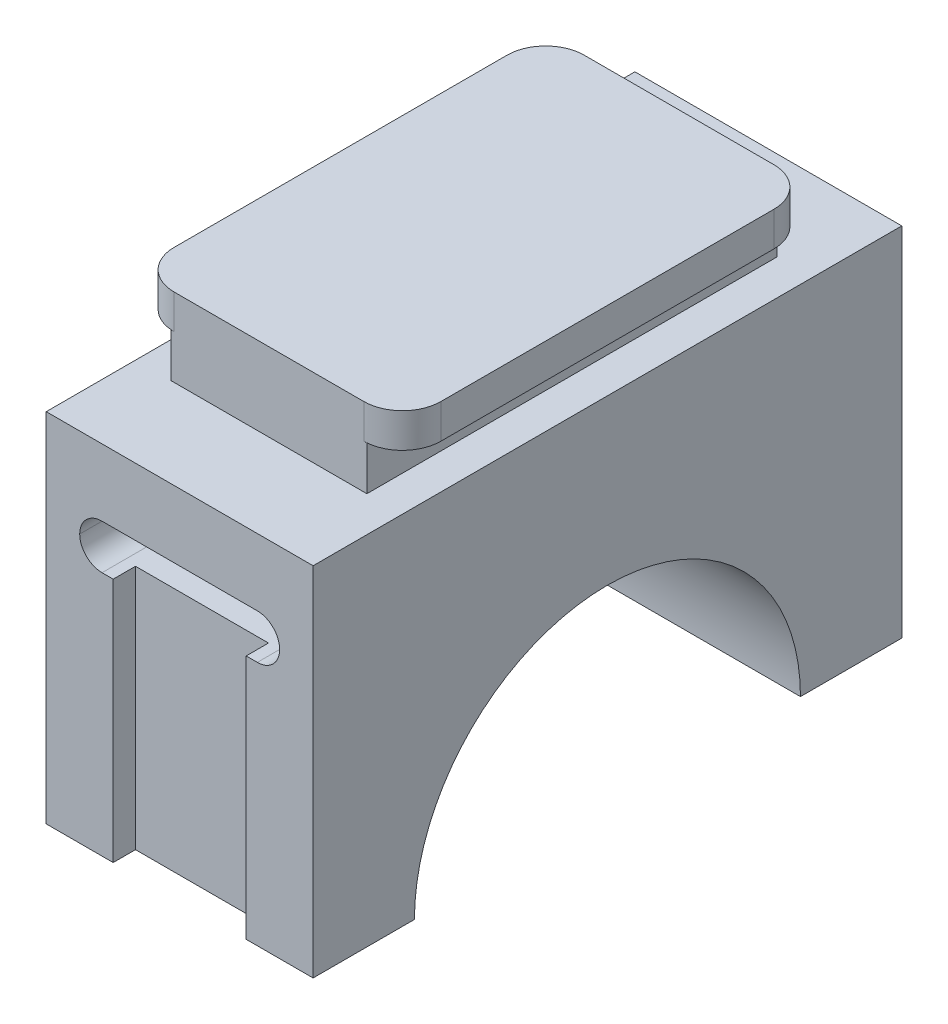
ISO-10303-21;
HEADER;
FILE_DESCRIPTION(('STEP AP214'),'2;1');
FILE_NAME('part.step','',(''),(''),'','','');
FILE_SCHEMA(('AUTOMOTIVE_DESIGN { 1 0 10303 214 1 1 1 1 }'));
ENDSEC;
DATA;
#1=APPLICATION_CONTEXT('core data for automotive mechanical design processes');
#2=APPLICATION_PROTOCOL_DEFINITION('international standard','automotive_design',2000,#1);
#3=PRODUCT_CONTEXT('',#1,'mechanical');
#4=PRODUCT('Part','Part','',(#3));
#5=PRODUCT_RELATED_PRODUCT_CATEGORY('part','',(#4));
#6=PRODUCT_DEFINITION_FORMATION('','',#4);
#7=PRODUCT_DEFINITION_CONTEXT('part definition',#1,'design');
#8=PRODUCT_DEFINITION('design','',#6,#7);
#9=PRODUCT_DEFINITION_SHAPE('','',#8);
#10=(LENGTH_UNIT() NAMED_UNIT(*) SI_UNIT(.MILLI.,.METRE.));
#11=(NAMED_UNIT(*) PLANE_ANGLE_UNIT() SI_UNIT($,.RADIAN.));
#12=(NAMED_UNIT(*) SI_UNIT($,.STERADIAN.) SOLID_ANGLE_UNIT());
#13=UNCERTAINTY_MEASURE_WITH_UNIT(LENGTH_MEASURE(1.E-05),#10,'distance_accuracy_value','');
#14=(GEOMETRIC_REPRESENTATION_CONTEXT(3) GLOBAL_UNCERTAINTY_ASSIGNED_CONTEXT((#13)) GLOBAL_UNIT_ASSIGNED_CONTEXT((#10,
#11,#12)) REPRESENTATION_CONTEXT('',''));
#15=CARTESIAN_POINT('',(0.,0.,0.));
#16=DIRECTION('',(0.,0.,1.));
#17=DIRECTION('',(1.,0.,0.));
#18=AXIS2_PLACEMENT_3D('',#15,#16,#17);
#19=CARTESIAN_POINT('',(0.,-22.8219,0.));
#20=DIRECTION('',(0.,-1.,0.));
#21=DIRECTION('',(0.,0.,-1.));
#22=AXIS2_PLACEMENT_3D('',#19,#20,#21);
#23=PLANE('',#22);
#24=DIRECTION('',(0.,0.,-1.));
#25=VECTOR('',#24,1.);
#26=CARTESIAN_POINT('',(11.3792,-22.8219,-3.81));
#27=LINE('',#26,#25);
#28=CARTESIAN_POINT('',(11.3792,-22.8219,-3.81));
#29=VERTEX_POINT('',#28);
#30=CARTESIAN_POINT('',(11.3792,-22.8219,-5.08));
#31=VERTEX_POINT('',#30);
#32=EDGE_CURVE('E298',#29,#31,#27,.T.);
#33=ORIENTED_EDGE('',*,*,#32,.T.);
#34=DIRECTION('',(1.,0.,0.));
#35=VECTOR('',#34,1.);
#36=CARTESIAN_POINT('',(15.1892,-22.8219,-5.08));
#37=LINE('',#36,#35);
#38=CARTESIAN_POINT('',(15.1892,-22.8219,-5.08));
#39=VERTEX_POINT('',#38);
#40=EDGE_CURVE('E341',#31,#39,#37,.T.);
#41=ORIENTED_EDGE('',*,*,#40,.T.);
#42=DIRECTION('',(0.,0.,1.));
#43=VECTOR('',#42,1.);
#44=CARTESIAN_POINT('',(15.1892,-22.8219,-5.08));
#45=LINE('',#44,#43);
#46=CARTESIAN_POINT('',(15.1892,-22.8219,0.685800000000004));
#47=VERTEX_POINT('',#46);
#48=EDGE_CURVE('E329',#39,#47,#45,.T.);
#49=ORIENTED_EDGE('',*,*,#48,.T.);
#50=DIRECTION('',(1.,0.,0.));
#51=VECTOR('',#50,1.);
#52=CARTESIAN_POINT('',(0.,-22.8219,0.685800000000004));
#53=LINE('',#52,#51);
#54=CARTESIAN_POINT('',(0.,-22.8219,0.685800000000004));
#55=VERTEX_POINT('',#54);
#56=EDGE_CURVE('E467',#55,#47,#53,.T.);
#57=ORIENTED_EDGE('',*,*,#56,.F.);
#58=DIRECTION('',(0.,0.,-1.));
#59=VECTOR('',#58,1.);
#60=CARTESIAN_POINT('',(0.,-22.8219,-5.08));
#61=LINE('',#60,#59);
#62=CARTESIAN_POINT('',(0.,-22.8219,-5.08));
#63=VERTEX_POINT('',#62);
#64=EDGE_CURVE('E337',#55,#63,#61,.T.);
#65=ORIENTED_EDGE('',*,*,#64,.T.);
#66=CARTESIAN_POINT('',(3.81,-22.8219,-5.08));
#67=VERTEX_POINT('',#66);
#68=EDGE_CURVE('E342',#63,#67,#37,.T.);
#69=ORIENTED_EDGE('',*,*,#68,.T.);
#70=DIRECTION('',(0.,0.,-1.));
#71=VECTOR('',#70,1.);
#72=CARTESIAN_POINT('',(3.81,-22.8219,-3.81));
#73=LINE('',#72,#71);
#74=CARTESIAN_POINT('',(3.81,-22.8219,-3.81));
#75=VERTEX_POINT('',#74);
#76=EDGE_CURVE('E307',#75,#67,#73,.T.);
#77=ORIENTED_EDGE('',*,*,#76,.F.);
#78=DIRECTION('',(-1.,0.,0.));
#79=VECTOR('',#78,1.);
#80=CARTESIAN_POINT('',(11.3792,-22.8219,-3.81));
#81=LINE('',#80,#79);
#82=EDGE_CURVE('E292',#29,#75,#81,.T.);
#83=ORIENTED_EDGE('',*,*,#82,.F.);
#84=EDGE_LOOP('',(#33,#41,#49,#57,#65,#69,#77,#83));
#85=FACE_BOUND('',#84,.T.);
#86=ADVANCED_FACE('F39',(#85),#23,.T.);
#87=CARTESIAN_POINT('',(2.1971,0.,21.1455));
#88=DIRECTION('',(0.,1.,0.));
#89=DIRECTION('',(0.,0.,1.));
#90=AXIS2_PLACEMENT_3D('',#87,#88,#89);
#91=PLANE('',#90);
#92=DIRECTION('',(0.,0.,1.));
#93=VECTOR('',#92,1.);
#94=CARTESIAN_POINT('',(13.1699,0.,0.));
#95=LINE('',#94,#93);
#96=CARTESIAN_POINT('',(13.1699,0.,0.00720603681365504));
#97=VERTEX_POINT('',#96);
#98=CARTESIAN_POINT('',(13.1699,0.,23.3353939631863));
#99=VERTEX_POINT('',#98);
#100=EDGE_CURVE('E384',#97,#99,#95,.T.);
#101=ORIENTED_EDGE('',*,*,#100,.F.);
#102=CARTESIAN_POINT('',(12.9921,0.,2.1971));
#103=DIRECTION('',(0.,1.,0.));
#104=DIRECTION('',(0.,0.,-1.));
#105=AXIS2_PLACEMENT_3D('',#102,#103,#104);
#106=CIRCLE('',#105,2.1971);
#107=CARTESIAN_POINT('',(15.1892,0.,2.19710000000002));
#108=VERTEX_POINT('',#107);
#109=EDGE_CURVE('E437',#108,#97,#106,.T.);
#110=ORIENTED_EDGE('',*,*,#109,.F.);
#111=DIRECTION('',(0.,0.,-1.));
#112=VECTOR('',#111,1.);
#113=CARTESIAN_POINT('',(15.1892,0.,2.19710000000001));
#114=LINE('',#113,#112);
#115=CARTESIAN_POINT('',(15.1892,0.,21.1455));
#116=VERTEX_POINT('',#115);
#117=EDGE_CURVE('E434',#116,#108,#114,.T.);
#118=ORIENTED_EDGE('',*,*,#117,.F.);
#119=CARTESIAN_POINT('',(12.9921,0.,21.1455));
#120=DIRECTION('',(0.,1.,0.));
#121=DIRECTION('',(0.,0.,1.));
#122=AXIS2_PLACEMENT_3D('',#119,#120,#121);
#123=CIRCLE('',#122,2.1971);
#124=EDGE_CURVE('E430',#99,#116,#123,.T.);
#125=ORIENTED_EDGE('',*,*,#124,.F.);
#126=EDGE_LOOP('',(#101,#110,#118,#125));
#127=FACE_BOUND('',#126,.T.);
#128=ADVANCED_FACE('F572',(#127),#91,.F.);
#129=DIRECTION('',(0.,0.,-1.));
#130=VECTOR('',#129,1.);
#131=CARTESIAN_POINT('',(2.0193,0.,0.));
#132=LINE('',#131,#130);
#133=CARTESIAN_POINT('',(2.0193,0.,23.3353939631863));
#134=VERTEX_POINT('',#133);
#135=CARTESIAN_POINT('',(2.0193,0.,0.00720603681365417));
#136=VERTEX_POINT('',#135);
#137=EDGE_CURVE('E393',#134,#136,#132,.T.);
#138=ORIENTED_EDGE('',*,*,#137,.F.);
#139=CARTESIAN_POINT('',(2.1971,0.,21.1455));
#140=DIRECTION('',(0.,1.,0.));
#141=DIRECTION('',(0.,0.,1.));
#142=AXIS2_PLACEMENT_3D('',#139,#140,#141);
#143=CIRCLE('',#142,2.1971);
#144=CARTESIAN_POINT('',(0.,0.,21.1455));
#145=VERTEX_POINT('',#144);
#146=EDGE_CURVE('E427',#145,#134,#143,.T.);
#147=ORIENTED_EDGE('',*,*,#146,.F.);
#148=DIRECTION('',(0.,0.,1.));
#149=VECTOR('',#148,1.);
#150=CARTESIAN_POINT('',(0.,0.,2.19710000000002));
#151=LINE('',#150,#149);
#152=CARTESIAN_POINT('',(0.,0.,2.19710000000002));
#153=VERTEX_POINT('',#152);
#154=EDGE_CURVE('E412',#153,#145,#151,.T.);
#155=ORIENTED_EDGE('',*,*,#154,.F.);
#156=CARTESIAN_POINT('',(2.1971,0.,2.1971));
#157=DIRECTION('',(0.,1.,0.));
#158=DIRECTION('',(0.,0.,1.));
#159=AXIS2_PLACEMENT_3D('',#156,#157,#158);
#160=CIRCLE('',#159,2.1971);
#161=EDGE_CURVE('E440',#136,#153,#160,.T.);
#162=ORIENTED_EDGE('',*,*,#161,.F.);
#163=EDGE_LOOP('',(#138,#147,#155,#162));
#164=FACE_BOUND('',#163,.T.);
#165=ADVANCED_FACE('F577',(#164),#91,.F.);
#166=CARTESIAN_POINT('',(2.1971,1.9558,21.1455));
#167=DIRECTION('',(0.,-1.,0.));
#168=DIRECTION('',(0.,0.,-1.));
#169=AXIS2_PLACEMENT_3D('',#166,#167,#168);
#170=CYLINDRICAL_SURFACE('',#169,2.1971);
#171=ORIENTED_EDGE('',*,*,#146,.T.);
#172=CARTESIAN_POINT('',(2.19710000000002,0.,23.3426));
#173=VERTEX_POINT('',#172);
#174=EDGE_CURVE('E407',#134,#173,#143,.T.);
#175=ORIENTED_EDGE('',*,*,#174,.T.);
#176=DIRECTION('',(0.,-1.,0.));
#177=VECTOR('',#176,1.);
#178=CARTESIAN_POINT('',(2.19710000000002,1.9558,23.3426));
#179=LINE('',#178,#177);
#180=CARTESIAN_POINT('',(2.19710000000002,1.9558,23.3426));
#181=VERTEX_POINT('',#180);
#182=EDGE_CURVE('E462',#181,#173,#179,.T.);
#183=ORIENTED_EDGE('',*,*,#182,.F.);
#184=CARTESIAN_POINT('',(2.1971,1.9558,21.1455));
#185=DIRECTION('',(0.,1.,0.));
#186=DIRECTION('',(0.,0.,1.));
#187=AXIS2_PLACEMENT_3D('',#184,#185,#186);
#188=CIRCLE('',#187,2.1971);
#189=CARTESIAN_POINT('',(0.,1.9558,21.1455));
#190=VERTEX_POINT('',#189);
#191=EDGE_CURVE('E408',#190,#181,#188,.T.);
#192=ORIENTED_EDGE('',*,*,#191,.F.);
#193=DIRECTION('',(0.,-1.,0.));
#194=VECTOR('',#193,1.);
#195=CARTESIAN_POINT('',(0.,1.9558,21.1455));
#196=LINE('',#195,#194);
#197=EDGE_CURVE('E426',#190,#145,#196,.T.);
#198=ORIENTED_EDGE('',*,*,#197,.T.);
#199=EDGE_LOOP('',(#171,#175,#183,#192,#198));
#200=FACE_BOUND('',#199,.T.);
#201=ADVANCED_FACE('F624',(#200),#170,.T.);
#202=CARTESIAN_POINT('',(2.19710000000002,1.9558,23.3426));
#203=DIRECTION('',(0.,0.,-1.));
#204=DIRECTION('',(-1.,0.,0.));
#205=AXIS2_PLACEMENT_3D('',#202,#203,#204);
#206=PLANE('',#205);
#207=ORIENTED_EDGE('',*,*,#182,.T.);
#208=DIRECTION('',(-1.,0.,0.));
#209=VECTOR('',#208,1.);
#210=CARTESIAN_POINT('',(13.1699,0.,23.3426));
#211=LINE('',#210,#209);
#212=CARTESIAN_POINT('',(2.0193,0.,23.3426));
#213=VERTEX_POINT('',#212);
#214=EDGE_CURVE('E383',#173,#213,#211,.T.);
#215=ORIENTED_EDGE('',*,*,#214,.T.);
#216=DIRECTION('',(0.,1.,0.));
#217=VECTOR('',#216,1.);
#218=CARTESIAN_POINT('',(2.0193,-2.5019,23.3426));
#219=LINE('',#218,#217);
#220=CARTESIAN_POINT('',(2.0193,-2.5019,23.3426));
#221=VERTEX_POINT('',#220);
#222=EDGE_CURVE('E401',#221,#213,#219,.T.);
#223=ORIENTED_EDGE('',*,*,#222,.F.);
#224=DIRECTION('',(-1.,0.,0.));
#225=VECTOR('',#224,1.);
#226=CARTESIAN_POINT('',(13.1699,-2.5019,23.3426));
#227=LINE('',#226,#225);
#228=CARTESIAN_POINT('',(13.1699,-2.5019,23.3426));
#229=VERTEX_POINT('',#228);
#230=EDGE_CURVE('E369',#229,#221,#227,.T.);
#231=ORIENTED_EDGE('',*,*,#230,.F.);
#232=DIRECTION('',(0.,1.,0.));
#233=VECTOR('',#232,1.);
#234=CARTESIAN_POINT('',(13.1699,-2.5019,23.3426));
#235=LINE('',#234,#233);
#236=CARTESIAN_POINT('',(13.1699,0.,23.3426));
#237=VERTEX_POINT('',#236);
#238=EDGE_CURVE('E404',#229,#237,#235,.T.);
#239=ORIENTED_EDGE('',*,*,#238,.T.);
#240=CARTESIAN_POINT('',(12.9921,0.,23.3426));
#241=VERTEX_POINT('',#240);
#242=EDGE_CURVE('E385',#237,#241,#211,.T.);
#243=ORIENTED_EDGE('',*,*,#242,.T.);
#244=DIRECTION('',(0.,-1.,0.));
#245=VECTOR('',#244,1.);
#246=CARTESIAN_POINT('',(12.9921,1.9558,23.3426));
#247=LINE('',#246,#245);
#248=CARTESIAN_POINT('',(12.9921,1.9558,23.3426));
#249=VERTEX_POINT('',#248);
#250=EDGE_CURVE('E460',#249,#241,#247,.T.);
#251=ORIENTED_EDGE('',*,*,#250,.F.);
#252=DIRECTION('',(1.,0.,0.));
#253=VECTOR('',#252,1.);
#254=CARTESIAN_POINT('',(2.19710000000002,1.9558,23.3426));
#255=LINE('',#254,#253);
#256=EDGE_CURVE('E411',#181,#249,#255,.T.);
#257=ORIENTED_EDGE('',*,*,#256,.F.);
#258=EDGE_LOOP('',(#207,#215,#223,#231,#239,#243,#251,#257));
#259=FACE_BOUND('',#258,.T.);
#260=ADVANCED_FACE('F627',(#259),#206,.F.);
#261=CARTESIAN_POINT('',(12.9921,1.9558,21.1455));
#262=DIRECTION('',(0.,-1.,0.));
#263=DIRECTION('',(0.,0.,-1.));
#264=AXIS2_PLACEMENT_3D('',#261,#262,#263);
#265=CYLINDRICAL_SURFACE('',#264,2.1971);
#266=EDGE_CURVE('E431',#241,#99,#123,.T.);
#267=ORIENTED_EDGE('',*,*,#266,.T.);
#268=ORIENTED_EDGE('',*,*,#124,.T.);
#269=DIRECTION('',(0.,-1.,0.));
#270=VECTOR('',#269,1.);
#271=CARTESIAN_POINT('',(15.1892,1.9558,21.1455));
#272=LINE('',#271,#270);
#273=CARTESIAN_POINT('',(15.1892,1.9558,21.1455));
#274=VERTEX_POINT('',#273);
#275=EDGE_CURVE('E457',#274,#116,#272,.T.);
#276=ORIENTED_EDGE('',*,*,#275,.F.);
#277=CARTESIAN_POINT('',(12.9921,1.9558,21.1455));
#278=DIRECTION('',(0.,1.,0.));
#279=DIRECTION('',(0.,0.,1.));
#280=AXIS2_PLACEMENT_3D('',#277,#278,#279);
#281=CIRCLE('',#280,2.1971);
#282=EDGE_CURVE('E414',#249,#274,#281,.T.);
#283=ORIENTED_EDGE('',*,*,#282,.F.);
#284=ORIENTED_EDGE('',*,*,#250,.T.);
#285=EDGE_LOOP('',(#267,#268,#276,#283,#284));
#286=FACE_BOUND('',#285,.T.);
#287=ADVANCED_FACE('F631',(#286),#265,.T.);
#288=CARTESIAN_POINT('',(15.1892,1.9558,2.19710000000001));
#289=DIRECTION('',(-1.,0.,0.));
#290=DIRECTION('',(0.,0.,1.));
#291=AXIS2_PLACEMENT_3D('',#288,#289,#290);
#292=PLANE('',#291);
#293=ORIENTED_EDGE('',*,*,#117,.T.);
#294=DIRECTION('',(0.,-1.,0.));
#295=VECTOR('',#294,1.);
#296=CARTESIAN_POINT('',(15.1892,1.9558,2.19710000000002));
#297=LINE('',#296,#295);
#298=CARTESIAN_POINT('',(15.1892,1.9558,2.19710000000002));
#299=VERTEX_POINT('',#298);
#300=EDGE_CURVE('E454',#299,#108,#297,.T.);
#301=ORIENTED_EDGE('',*,*,#300,.F.);
#302=DIRECTION('',(0.,0.,-1.));
#303=VECTOR('',#302,1.);
#304=CARTESIAN_POINT('',(15.1892,1.9558,2.19710000000001));
#305=LINE('',#304,#303);
#306=EDGE_CURVE('E416',#274,#299,#305,.T.);
#307=ORIENTED_EDGE('',*,*,#306,.F.);
#308=ORIENTED_EDGE('',*,*,#275,.T.);
#309=EDGE_LOOP('',(#293,#301,#307,#308));
#310=FACE_BOUND('',#309,.T.);
#311=ADVANCED_FACE('F635',(#310),#292,.F.);
#312=CARTESIAN_POINT('',(12.9921,1.9558,2.1971));
#313=DIRECTION('',(0.,-1.,0.));
#314=DIRECTION('',(0.,0.,-1.));
#315=AXIS2_PLACEMENT_3D('',#312,#313,#314);
#316=CYLINDRICAL_SURFACE('',#315,2.1971);
#317=ORIENTED_EDGE('',*,*,#109,.T.);
#318=CARTESIAN_POINT('',(12.9921,0.,0.));
#319=VERTEX_POINT('',#318);
#320=EDGE_CURVE('E436',#97,#319,#106,.T.);
#321=ORIENTED_EDGE('',*,*,#320,.T.);
#322=DIRECTION('',(0.,-1.,0.));
#323=VECTOR('',#322,1.);
#324=CARTESIAN_POINT('',(12.9921,1.9558,0.));
#325=LINE('',#324,#323);
#326=CARTESIAN_POINT('',(12.9921,1.9558,0.));
#327=VERTEX_POINT('',#326);
#328=EDGE_CURVE('E451',#327,#319,#325,.T.);
#329=ORIENTED_EDGE('',*,*,#328,.F.);
#330=CARTESIAN_POINT('',(12.9921,1.9558,2.1971));
#331=DIRECTION('',(0.,1.,0.));
#332=DIRECTION('',(0.,0.,-1.));
#333=AXIS2_PLACEMENT_3D('',#330,#331,#332);
#334=CIRCLE('',#333,2.1971);
#335=EDGE_CURVE('E418',#299,#327,#334,.T.);
#336=ORIENTED_EDGE('',*,*,#335,.F.);
#337=ORIENTED_EDGE('',*,*,#300,.T.);
#338=EDGE_LOOP('',(#317,#321,#329,#336,#337));
#339=FACE_BOUND('',#338,.T.);
#340=ADVANCED_FACE('F639',(#339),#316,.T.);
#341=CARTESIAN_POINT('',(2.19710000000002,1.9558,0.));
#342=DIRECTION('',(0.,0.,1.));
#343=DIRECTION('',(1.,0.,0.));
#344=AXIS2_PLACEMENT_3D('',#341,#342,#343);
#345=PLANE('',#344);
#346=ORIENTED_EDGE('',*,*,#328,.T.);
#347=DIRECTION('',(1.,0.,0.));
#348=VECTOR('',#347,1.);
#349=CARTESIAN_POINT('',(13.1699,0.,0.));
#350=LINE('',#349,#348);
#351=CARTESIAN_POINT('',(13.1699,0.,0.));
#352=VERTEX_POINT('',#351);
#353=EDGE_CURVE('E392',#319,#352,#350,.T.);
#354=ORIENTED_EDGE('',*,*,#353,.T.);
#355=DIRECTION('',(0.,1.,0.));
#356=VECTOR('',#355,1.);
#357=CARTESIAN_POINT('',(13.1699,-2.5019,0.));
#358=LINE('',#357,#356);
#359=CARTESIAN_POINT('',(13.1699,-2.5019,0.));
#360=VERTEX_POINT('',#359);
#361=EDGE_CURVE('E379',#360,#352,#358,.T.);
#362=ORIENTED_EDGE('',*,*,#361,.F.);
#363=DIRECTION('',(1.,0.,0.));
#364=VECTOR('',#363,1.);
#365=CARTESIAN_POINT('',(13.1699,-2.5019,0.));
#366=LINE('',#365,#364);
#367=CARTESIAN_POINT('',(2.0193,-2.5019,0.));
#368=VERTEX_POINT('',#367);
#369=EDGE_CURVE('E376',#368,#360,#366,.T.);
#370=ORIENTED_EDGE('',*,*,#369,.F.);
#371=DIRECTION('',(0.,1.,0.));
#372=VECTOR('',#371,1.);
#373=CARTESIAN_POINT('',(2.0193,-2.5019,0.));
#374=LINE('',#373,#372);
#375=CARTESIAN_POINT('',(2.0193,0.,0.));
#376=VERTEX_POINT('',#375);
#377=EDGE_CURVE('E398',#368,#376,#374,.T.);
#378=ORIENTED_EDGE('',*,*,#377,.T.);
#379=CARTESIAN_POINT('',(2.19710000000002,0.,0.));
#380=VERTEX_POINT('',#379);
#381=EDGE_CURVE('E370',#376,#380,#350,.T.);
#382=ORIENTED_EDGE('',*,*,#381,.T.);
#383=DIRECTION('',(0.,-1.,0.));
#384=VECTOR('',#383,1.);
#385=CARTESIAN_POINT('',(2.19710000000002,1.9558,0.));
#386=LINE('',#385,#384);
#387=CARTESIAN_POINT('',(2.19710000000002,1.9558,0.));
#388=VERTEX_POINT('',#387);
#389=EDGE_CURVE('E449',#388,#380,#386,.T.);
#390=ORIENTED_EDGE('',*,*,#389,.F.);
#391=DIRECTION('',(-1.,0.,0.));
#392=VECTOR('',#391,1.);
#393=CARTESIAN_POINT('',(2.19710000000002,1.9558,0.));
#394=LINE('',#393,#392);
#395=EDGE_CURVE('E420',#327,#388,#394,.T.);
#396=ORIENTED_EDGE('',*,*,#395,.F.);
#397=EDGE_LOOP('',(#346,#354,#362,#370,#378,#382,#390,#396));
#398=FACE_BOUND('',#397,.T.);
#399=ADVANCED_FACE('F643',(#398),#345,.F.);
#400=CARTESIAN_POINT('',(2.1971,1.9558,2.1971));
#401=DIRECTION('',(0.,-1.,0.));
#402=DIRECTION('',(0.,0.,-1.));
#403=AXIS2_PLACEMENT_3D('',#400,#401,#402);
#404=CYLINDRICAL_SURFACE('',#403,2.1971);
#405=EDGE_CURVE('E441',#380,#136,#160,.T.);
#406=ORIENTED_EDGE('',*,*,#405,.T.);
#407=ORIENTED_EDGE('',*,*,#161,.T.);
#408=DIRECTION('',(0.,-1.,0.));
#409=VECTOR('',#408,1.);
#410=CARTESIAN_POINT('',(0.,1.9558,2.19710000000002));
#411=LINE('',#410,#409);
#412=CARTESIAN_POINT('',(0.,1.9558,2.19710000000002));
#413=VERTEX_POINT('',#412);
#414=EDGE_CURVE('E446',#413,#153,#411,.T.);
#415=ORIENTED_EDGE('',*,*,#414,.F.);
#416=CARTESIAN_POINT('',(2.1971,1.9558,2.1971));
#417=DIRECTION('',(0.,1.,0.));
#418=DIRECTION('',(0.,0.,1.));
#419=AXIS2_PLACEMENT_3D('',#416,#417,#418);
#420=CIRCLE('',#419,2.1971);
#421=EDGE_CURVE('E422',#388,#413,#420,.T.);
#422=ORIENTED_EDGE('',*,*,#421,.F.);
#423=ORIENTED_EDGE('',*,*,#389,.T.);
#424=EDGE_LOOP('',(#406,#407,#415,#422,#423));
#425=FACE_BOUND('',#424,.T.);
#426=ADVANCED_FACE('F647',(#425),#404,.T.);
#427=CARTESIAN_POINT('',(0.,1.9558,2.19710000000002));
#428=DIRECTION('',(1.,0.,0.));
#429=DIRECTION('',(0.,0.,-1.));
#430=AXIS2_PLACEMENT_3D('',#427,#428,#429);
#431=PLANE('',#430);
#432=ORIENTED_EDGE('',*,*,#154,.T.);
#433=ORIENTED_EDGE('',*,*,#197,.F.);
#434=DIRECTION('',(0.,0.,1.));
#435=VECTOR('',#434,1.);
#436=CARTESIAN_POINT('',(0.,1.9558,2.19710000000002));
#437=LINE('',#436,#435);
#438=EDGE_CURVE('E424',#413,#190,#437,.T.);
#439=ORIENTED_EDGE('',*,*,#438,.F.);
#440=ORIENTED_EDGE('',*,*,#414,.T.);
#441=EDGE_LOOP('',(#432,#433,#439,#440));
#442=FACE_BOUND('',#441,.T.);
#443=ADVANCED_FACE('F651',(#442),#431,.F.);
#444=CARTESIAN_POINT('',(2.1971,1.9558,21.1455));
#445=DIRECTION('',(0.,1.,0.));
#446=DIRECTION('',(0.,0.,1.));
#447=AXIS2_PLACEMENT_3D('',#444,#445,#446);
#448=PLANE('',#447);
#449=ORIENTED_EDGE('',*,*,#191,.T.);
#450=ORIENTED_EDGE('',*,*,#256,.T.);
#451=ORIENTED_EDGE('',*,*,#282,.T.);
#452=ORIENTED_EDGE('',*,*,#306,.T.);
#453=ORIENTED_EDGE('',*,*,#335,.T.);
#454=ORIENTED_EDGE('',*,*,#395,.T.);
#455=ORIENTED_EDGE('',*,*,#421,.T.);
#456=ORIENTED_EDGE('',*,*,#438,.T.);
#457=EDGE_LOOP('',(#449,#450,#451,#452,#453,#454,#455,#456));
#458=FACE_BOUND('',#457,.T.);
#459=ADVANCED_FACE('F654',(#458),#448,.T.);
#460=CARTESIAN_POINT('',(0.,0.,0.));
#461=DIRECTION('',(0.,-1.,0.));
#462=DIRECTION('',(0.,0.,-1.));
#463=AXIS2_PLACEMENT_3D('',#460,#461,#462);
#464=PLANE('',#463);
#465=ORIENTED_EDGE('',*,*,#174,.F.);
#466=EDGE_CURVE('E389',#213,#134,#132,.T.);
#467=ORIENTED_EDGE('',*,*,#466,.F.);
#468=ORIENTED_EDGE('',*,*,#214,.F.);
#469=EDGE_LOOP('',(#465,#467,#468));
#470=FACE_BOUND('',#469,.T.);
#471=ADVANCED_FACE('F659',(#470),#464,.F.);
#472=ORIENTED_EDGE('',*,*,#405,.F.);
#473=ORIENTED_EDGE('',*,*,#381,.F.);
#474=EDGE_CURVE('E388',#136,#376,#132,.T.);
#475=ORIENTED_EDGE('',*,*,#474,.F.);
#476=EDGE_LOOP('',(#472,#473,#475));
#477=FACE_BOUND('',#476,.T.);
#478=ADVANCED_FACE('F813',(#477),#464,.F.);
#479=ORIENTED_EDGE('',*,*,#320,.F.);
#480=EDGE_CURVE('E380',#352,#97,#95,.T.);
#481=ORIENTED_EDGE('',*,*,#480,.F.);
#482=ORIENTED_EDGE('',*,*,#353,.F.);
#483=EDGE_LOOP('',(#479,#481,#482));
#484=FACE_BOUND('',#483,.T.);
#485=ADVANCED_FACE('F665',(#484),#464,.F.);
#486=CARTESIAN_POINT('',(13.1699,-2.5019,0.));
#487=DIRECTION('',(-1.,0.,0.));
#488=DIRECTION('',(0.,0.,1.));
#489=AXIS2_PLACEMENT_3D('',#486,#487,#488);
#490=PLANE('',#489);
#491=ORIENTED_EDGE('',*,*,#480,.T.);
#492=ORIENTED_EDGE('',*,*,#100,.T.);
#493=EDGE_CURVE('E365',#99,#237,#95,.T.);
#494=ORIENTED_EDGE('',*,*,#493,.T.);
#495=ORIENTED_EDGE('',*,*,#238,.F.);
#496=DIRECTION('',(0.,0.,1.));
#497=VECTOR('',#496,1.);
#498=CARTESIAN_POINT('',(13.1699,-2.5019,0.));
#499=LINE('',#498,#497);
#500=EDGE_CURVE('E366',#360,#229,#499,.T.);
#501=ORIENTED_EDGE('',*,*,#500,.F.);
#502=ORIENTED_EDGE('',*,*,#361,.T.);
#503=EDGE_LOOP('',(#491,#492,#494,#495,#501,#502));
#504=FACE_BOUND('',#503,.T.);
#505=ADVANCED_FACE('F661',(#504),#490,.F.);
#506=CARTESIAN_POINT('',(2.0193,-2.5019,0.));
#507=DIRECTION('',(1.,0.,0.));
#508=DIRECTION('',(0.,0.,-1.));
#509=AXIS2_PLACEMENT_3D('',#506,#507,#508);
#510=PLANE('',#509);
#511=ORIENTED_EDGE('',*,*,#466,.T.);
#512=ORIENTED_EDGE('',*,*,#137,.T.);
#513=ORIENTED_EDGE('',*,*,#474,.T.);
#514=ORIENTED_EDGE('',*,*,#377,.F.);
#515=DIRECTION('',(0.,0.,-1.));
#516=VECTOR('',#515,1.);
#517=CARTESIAN_POINT('',(2.0193,-2.5019,0.));
#518=LINE('',#517,#516);
#519=EDGE_CURVE('E373',#221,#368,#518,.T.);
#520=ORIENTED_EDGE('',*,*,#519,.F.);
#521=ORIENTED_EDGE('',*,*,#222,.T.);
#522=EDGE_LOOP('',(#511,#512,#513,#514,#520,#521));
#523=FACE_BOUND('',#522,.T.);
#524=ADVANCED_FACE('F664',(#523),#510,.F.);
#525=ORIENTED_EDGE('',*,*,#266,.F.);
#526=ORIENTED_EDGE('',*,*,#242,.F.);
#527=ORIENTED_EDGE('',*,*,#493,.F.);
#528=EDGE_LOOP('',(#525,#526,#527));
#529=FACE_BOUND('',#528,.T.);
#530=ADVANCED_FACE('F669',(#529),#464,.F.);
#531=CARTESIAN_POINT('',(0.,-2.5019,0.));
#532=DIRECTION('',(0.,-1.,0.));
#533=DIRECTION('',(0.,0.,-1.));
#534=AXIS2_PLACEMENT_3D('',#531,#532,#533);
#535=PLANE('',#534);
#536=DIRECTION('',(0.,0.,1.));
#537=VECTOR('',#536,1.);
#538=CARTESIAN_POINT('',(15.1892,-2.5019,-5.08));
#539=LINE('',#538,#537);
#540=CARTESIAN_POINT('',(15.1892,-2.5019,-5.08));
#541=VERTEX_POINT('',#540);
#542=CARTESIAN_POINT('',(15.1892,-2.5019,28.4226));
#543=VERTEX_POINT('',#542);
#544=EDGE_CURVE('E327',#541,#543,#539,.T.);
#545=ORIENTED_EDGE('',*,*,#544,.F.);
#546=DIRECTION('',(1.,0.,0.));
#547=VECTOR('',#546,1.);
#548=CARTESIAN_POINT('',(15.1892,-2.5019,-5.08));
#549=LINE('',#548,#547);
#550=CARTESIAN_POINT('',(0.,-2.5019,-5.08));
#551=VERTEX_POINT('',#550);
#552=EDGE_CURVE('E352',#551,#541,#549,.T.);
#553=ORIENTED_EDGE('',*,*,#552,.F.);
#554=DIRECTION('',(0.,0.,-1.));
#555=VECTOR('',#554,1.);
#556=CARTESIAN_POINT('',(0.,-2.5019,-5.08));
#557=LINE('',#556,#555);
#558=CARTESIAN_POINT('',(0.,-2.5019,28.4226));
#559=VERTEX_POINT('',#558);
#560=EDGE_CURVE('E350',#559,#551,#557,.T.);
#561=ORIENTED_EDGE('',*,*,#560,.F.);
#562=DIRECTION('',(-1.,0.,0.));
#563=VECTOR('',#562,1.);
#564=CARTESIAN_POINT('',(15.1892,-2.5019,28.4226));
#565=LINE('',#564,#563);
#566=EDGE_CURVE('E348',#543,#559,#565,.T.);
#567=ORIENTED_EDGE('',*,*,#566,.F.);
#568=EDGE_LOOP('',(#545,#553,#561,#567));
#569=FACE_BOUND('',#568,.T.);
#570=ORIENTED_EDGE('',*,*,#369,.T.);
#571=ORIENTED_EDGE('',*,*,#500,.T.);
#572=ORIENTED_EDGE('',*,*,#230,.T.);
#573=ORIENTED_EDGE('',*,*,#519,.T.);
#574=EDGE_LOOP('',(#570,#571,#572,#573));
#575=FACE_BOUND('',#574,.T.);
#576=ADVANCED_FACE('F531',(#569,#575),#535,.F.);
#577=CARTESIAN_POINT('',(15.1892,-22.8219,-5.08));
#578=DIRECTION('',(-1.,0.,0.));
#579=DIRECTION('',(0.,0.,1.));
#580=AXIS2_PLACEMENT_3D('',#577,#578,#579);
#581=PLANE('',#580);
#582=CARTESIAN_POINT('',(15.1892,-22.8219,22.6568));
#583=VERTEX_POINT('',#582);
#584=CARTESIAN_POINT('',(15.1892,-22.8219,28.4226));
#585=VERTEX_POINT('',#584);
#586=EDGE_CURVE('E333',#583,#585,#45,.T.);
#587=ORIENTED_EDGE('',*,*,#586,.F.);
#588=CARTESIAN_POINT('',(15.1892,-22.8219,11.6713));
#589=DIRECTION('',(1.,0.,0.));
#590=DIRECTION('',(0.,0.,-1.));
#591=AXIS2_PLACEMENT_3D('',#588,#589,#590);
#592=CIRCLE('',#591,10.9855);
#593=EDGE_CURVE('E318',#47,#583,#592,.T.);
#594=ORIENTED_EDGE('',*,*,#593,.F.);
#595=ORIENTED_EDGE('',*,*,#48,.F.);
#596=DIRECTION('',(0.,1.,0.));
#597=VECTOR('',#596,1.);
#598=CARTESIAN_POINT('',(15.1892,-22.8219,-5.08));
#599=LINE('',#598,#597);
#600=EDGE_CURVE('E345',#39,#541,#599,.T.);
#601=ORIENTED_EDGE('',*,*,#600,.T.);
#602=ORIENTED_EDGE('',*,*,#544,.T.);
#603=DIRECTION('',(0.,1.,0.));
#604=VECTOR('',#603,1.);
#605=CARTESIAN_POINT('',(15.1892,-22.8219,28.4226));
#606=LINE('',#605,#604);
#607=EDGE_CURVE('E362',#585,#543,#606,.T.);
#608=ORIENTED_EDGE('',*,*,#607,.F.);
#609=EDGE_LOOP('',(#587,#594,#595,#601,#602,#608));
#610=FACE_BOUND('',#609,.T.);
#611=ADVANCED_FACE('F536',(#610),#581,.F.);
#612=CARTESIAN_POINT('',(15.1892,-22.8219,28.4226));
#613=DIRECTION('',(0.,0.,-1.));
#614=DIRECTION('',(-1.,0.,0.));
#615=AXIS2_PLACEMENT_3D('',#612,#613,#614);
#616=PLANE('',#615);
#617=DIRECTION('',(1.,0.,0.));
#618=VECTOR('',#617,1.);
#619=CARTESIAN_POINT('',(1.905,-8.8519,28.4226));
#620=LINE('',#619,#618);
#621=CARTESIAN_POINT('',(11.3792,-8.8519,28.4226));
#622=VERTEX_POINT('',#621);
#623=CARTESIAN_POINT('',(12.0142,-8.8519,28.4226));
#624=VERTEX_POINT('',#623);
#625=EDGE_CURVE('E321',#622,#624,#620,.T.);
#626=ORIENTED_EDGE('',*,*,#625,.F.);
#627=DIRECTION('',(0.,1.,0.));
#628=VECTOR('',#627,1.);
#629=CARTESIAN_POINT('',(11.3792,-22.8219,28.4226));
#630=LINE('',#629,#628);
#631=CARTESIAN_POINT('',(11.3792,-22.8219,28.4226));
#632=VERTEX_POINT('',#631);
#633=EDGE_CURVE('E593',#632,#622,#630,.T.);
#634=ORIENTED_EDGE('',*,*,#633,.F.);
#635=DIRECTION('',(-1.,0.,0.));
#636=VECTOR('',#635,1.);
#637=CARTESIAN_POINT('',(15.1892,-22.8219,28.4226));
#638=LINE('',#637,#636);
#639=EDGE_CURVE('E334',#585,#632,#638,.T.);
#640=ORIENTED_EDGE('',*,*,#639,.F.);
#641=ORIENTED_EDGE('',*,*,#607,.T.);
#642=ORIENTED_EDGE('',*,*,#566,.T.);
#643=DIRECTION('',(0.,1.,0.));
#644=VECTOR('',#643,1.);
#645=CARTESIAN_POINT('',(0.,-22.8219,28.4226));
#646=LINE('',#645,#644);
#647=CARTESIAN_POINT('',(0.,-22.8219,28.4226));
#648=VERTEX_POINT('',#647);
#649=EDGE_CURVE('E359',#648,#559,#646,.T.);
#650=ORIENTED_EDGE('',*,*,#649,.F.);
#651=CARTESIAN_POINT('',(3.81,-22.8219,28.4226));
#652=VERTEX_POINT('',#651);
#653=EDGE_CURVE('E332',#652,#648,#638,.T.);
#654=ORIENTED_EDGE('',*,*,#653,.F.);
#655=DIRECTION('',(0.,-1.,0.));
#656=VECTOR('',#655,1.);
#657=CARTESIAN_POINT('',(3.81,-22.8219,28.4226));
#658=LINE('',#657,#656);
#659=CARTESIAN_POINT('',(3.81,-8.8519,28.4226));
#660=VERTEX_POINT('',#659);
#661=EDGE_CURVE('E591',#660,#652,#658,.T.);
#662=ORIENTED_EDGE('',*,*,#661,.F.);
#663=CARTESIAN_POINT('',(3.175,-8.8519,28.4226));
#664=VERTEX_POINT('',#663);
#665=EDGE_CURVE('E281',#664,#660,#620,.T.);
#666=ORIENTED_EDGE('',*,*,#665,.F.);
#667=CARTESIAN_POINT('',(3.175,-7.5819,28.4226));
#668=DIRECTION('',(0.,0.,-1.));
#669=DIRECTION('',(-1.,0.,0.));
#670=AXIS2_PLACEMENT_3D('',#667,#668,#669);
#671=CIRCLE('',#670,1.27);
#672=CARTESIAN_POINT('',(1.905,-7.5819,28.4226));
#673=VERTEX_POINT('',#672);
#674=EDGE_CURVE('E48',#664,#673,#671,.T.);
#675=ORIENTED_EDGE('',*,*,#674,.T.);
#676=CARTESIAN_POINT('',(3.175,-7.5819,28.4226));
#677=DIRECTION('',(0.,0.,-1.));
#678=DIRECTION('',(-1.,0.,0.));
#679=AXIS2_PLACEMENT_3D('',#676,#677,#678);
#680=CIRCLE('',#679,1.27);
#681=CARTESIAN_POINT('',(3.175,-6.3119,28.4226));
#682=VERTEX_POINT('',#681);
#683=EDGE_CURVE('E488',#673,#682,#680,.T.);
#684=ORIENTED_EDGE('',*,*,#683,.T.);
#685=DIRECTION('',(-1.,0.,0.));
#686=VECTOR('',#685,1.);
#687=CARTESIAN_POINT('',(1.905,-6.3119,28.4226));
#688=LINE('',#687,#686);
#689=CARTESIAN_POINT('',(12.0142,-6.3119,28.4226));
#690=VERTEX_POINT('',#689);
#691=EDGE_CURVE('E320',#690,#682,#688,.T.);
#692=ORIENTED_EDGE('',*,*,#691,.F.);
#693=CARTESIAN_POINT('',(12.0142,-7.5819,28.4226));
#694=DIRECTION('',(0.,0.,-1.));
#695=DIRECTION('',(-1.,0.,0.));
#696=AXIS2_PLACEMENT_3D('',#693,#694,#695);
#697=CIRCLE('',#696,1.27);
#698=CARTESIAN_POINT('',(13.2842,-7.5819,28.4226));
#699=VERTEX_POINT('',#698);
#700=EDGE_CURVE('E484',#690,#699,#697,.T.);
#701=ORIENTED_EDGE('',*,*,#700,.T.);
#702=CARTESIAN_POINT('',(12.0142,-7.5819,28.4226));
#703=DIRECTION('',(0.,0.,-1.));
#704=DIRECTION('',(-1.,0.,0.));
#705=AXIS2_PLACEMENT_3D('',#702,#703,#704);
#706=CIRCLE('',#705,1.27);
#707=EDGE_CURVE('E479',#699,#624,#706,.T.);
#708=ORIENTED_EDGE('',*,*,#707,.T.);
#709=EDGE_LOOP('',(#626,#634,#640,#641,#642,#650,#654,#662,#666,#675,#684,#692,#701,#708));
#710=FACE_BOUND('',#709,.T.);
#711=ADVANCED_FACE('F549',(#710),#616,.F.);
#712=CARTESIAN_POINT('',(0.,-22.8219,-5.08));
#713=DIRECTION('',(1.,0.,0.));
#714=DIRECTION('',(0.,0.,-1.));
#715=AXIS2_PLACEMENT_3D('',#712,#713,#714);
#716=PLANE('',#715);
#717=ORIENTED_EDGE('',*,*,#64,.F.);
#718=CARTESIAN_POINT('',(0.,-22.8219,11.6713));
#719=DIRECTION('',(1.,0.,0.));
#720=DIRECTION('',(0.,0.,-1.));
#721=AXIS2_PLACEMENT_3D('',#718,#719,#720);
#722=CIRCLE('',#721,10.9855);
#723=CARTESIAN_POINT('',(0.,-22.8219,22.6568));
#724=VERTEX_POINT('',#723);
#725=EDGE_CURVE('E324',#55,#724,#722,.T.);
#726=ORIENTED_EDGE('',*,*,#725,.T.);
#727=EDGE_CURVE('E338',#648,#724,#61,.T.);
#728=ORIENTED_EDGE('',*,*,#727,.F.);
#729=ORIENTED_EDGE('',*,*,#649,.T.);
#730=ORIENTED_EDGE('',*,*,#560,.T.);
#731=DIRECTION('',(0.,1.,0.));
#732=VECTOR('',#731,1.);
#733=CARTESIAN_POINT('',(0.,-22.8219,-5.08));
#734=LINE('',#733,#732);
#735=EDGE_CURVE('E356',#63,#551,#734,.T.);
#736=ORIENTED_EDGE('',*,*,#735,.F.);
#737=EDGE_LOOP('',(#717,#726,#728,#729,#730,#736));
#738=FACE_BOUND('',#737,.T.);
#739=ADVANCED_FACE('F525',(#738),#716,.F.);
#740=CARTESIAN_POINT('',(15.1892,-22.8219,-5.08));
#741=DIRECTION('',(0.,0.,1.));
#742=DIRECTION('',(1.,0.,0.));
#743=AXIS2_PLACEMENT_3D('',#740,#741,#742);
#744=PLANE('',#743);
#745=ORIENTED_EDGE('',*,*,#40,.F.);
#746=DIRECTION('',(0.,-1.,0.));
#747=VECTOR('',#746,1.);
#748=CARTESIAN_POINT('',(11.3792,-8.8519,-5.08));
#749=LINE('',#748,#747);
#750=CARTESIAN_POINT('',(11.3792,-8.8519,-5.08));
#751=VERTEX_POINT('',#750);
#752=EDGE_CURVE('E299',#751,#31,#749,.T.);
#753=ORIENTED_EDGE('',*,*,#752,.F.);
#754=DIRECTION('',(1.,0.,0.));
#755=VECTOR('',#754,1.);
#756=CARTESIAN_POINT('',(1.905,-8.8519,-5.08));
#757=LINE('',#756,#755);
#758=CARTESIAN_POINT('',(12.0142,-8.8519,-5.08));
#759=VERTEX_POINT('',#758);
#760=EDGE_CURVE('E315',#751,#759,#757,.T.);
#761=ORIENTED_EDGE('',*,*,#760,.T.);
#762=CARTESIAN_POINT('',(12.0142,-7.5819,-5.08));
#763=DIRECTION('',(0.,0.,1.));
#764=DIRECTION('',(1.,0.,0.));
#765=AXIS2_PLACEMENT_3D('',#762,#763,#764);
#766=CIRCLE('',#765,1.27);
#767=CARTESIAN_POINT('',(13.2842,-7.5819,-5.08));
#768=VERTEX_POINT('',#767);
#769=EDGE_CURVE('E482',#759,#768,#766,.T.);
#770=ORIENTED_EDGE('',*,*,#769,.T.);
#771=CARTESIAN_POINT('',(12.0142,-7.5819,-5.08));
#772=DIRECTION('',(0.,0.,1.));
#773=DIRECTION('',(1.,0.,0.));
#774=AXIS2_PLACEMENT_3D('',#771,#772,#773);
#775=CIRCLE('',#774,1.27);
#776=CARTESIAN_POINT('',(12.0142,-6.3119,-5.08));
#777=VERTEX_POINT('',#776);
#778=EDGE_CURVE('E486',#768,#777,#775,.T.);
#779=ORIENTED_EDGE('',*,*,#778,.T.);
#780=DIRECTION('',(-1.,0.,0.));
#781=VECTOR('',#780,1.);
#782=CARTESIAN_POINT('',(1.905,-6.3119,-5.08));
#783=LINE('',#782,#781);
#784=CARTESIAN_POINT('',(3.175,-6.3119,-5.08));
#785=VERTEX_POINT('',#784);
#786=EDGE_CURVE('E314',#777,#785,#783,.T.);
#787=ORIENTED_EDGE('',*,*,#786,.T.);
#788=CARTESIAN_POINT('',(3.175,-7.5819,-5.08));
#789=DIRECTION('',(0.,0.,1.));
#790=DIRECTION('',(1.,0.,0.));
#791=AXIS2_PLACEMENT_3D('',#788,#789,#790);
#792=CIRCLE('',#791,1.27);
#793=CARTESIAN_POINT('',(1.905,-7.5819,-5.08));
#794=VERTEX_POINT('',#793);
#795=EDGE_CURVE('E490',#785,#794,#792,.T.);
#796=ORIENTED_EDGE('',*,*,#795,.T.);
#797=CARTESIAN_POINT('',(3.175,-7.5819,-5.08));
#798=DIRECTION('',(0.,0.,1.));
#799=DIRECTION('',(1.,0.,0.));
#800=AXIS2_PLACEMENT_3D('',#797,#798,#799);
#801=CIRCLE('',#800,1.27);
#802=CARTESIAN_POINT('',(3.175,-8.8519,-5.08));
#803=VERTEX_POINT('',#802);
#804=EDGE_CURVE('E11',#794,#803,#801,.T.);
#805=ORIENTED_EDGE('',*,*,#804,.T.);
#806=CARTESIAN_POINT('',(3.81,-8.8519,-5.08));
#807=VERTEX_POINT('',#806);
#808=EDGE_CURVE('E311',#803,#807,#757,.T.);
#809=ORIENTED_EDGE('',*,*,#808,.T.);
#810=DIRECTION('',(0.,1.,0.));
#811=VECTOR('',#810,1.);
#812=CARTESIAN_POINT('',(3.81,-8.8519,-5.08));
#813=LINE('',#812,#811);
#814=EDGE_CURVE('E293',#67,#807,#813,.T.);
#815=ORIENTED_EDGE('',*,*,#814,.F.);
#816=ORIENTED_EDGE('',*,*,#68,.F.);
#817=ORIENTED_EDGE('',*,*,#735,.T.);
#818=ORIENTED_EDGE('',*,*,#552,.T.);
#819=ORIENTED_EDGE('',*,*,#600,.F.);
#820=EDGE_LOOP('',(#745,#753,#761,#770,#779,#787,#796,#805,#809,#815,#816,#817,#818,#819));
#821=FACE_BOUND('',#820,.T.);
#822=ADVANCED_FACE('F511',(#821),#744,.F.);
#823=DIRECTION('',(0.,0.,1.));
#824=VECTOR('',#823,1.);
#825=CARTESIAN_POINT('',(11.3792,-22.8219,27.1526));
#826=LINE('',#825,#824);
#827=CARTESIAN_POINT('',(11.3792,-22.8219,27.1526));
#828=VERTEX_POINT('',#827);
#829=EDGE_CURVE('E284',#828,#632,#826,.T.);
#830=ORIENTED_EDGE('',*,*,#829,.F.);
#831=DIRECTION('',(1.,0.,0.));
#832=VECTOR('',#831,1.);
#833=CARTESIAN_POINT('',(11.3792,-22.8219,27.1526));
#834=LINE('',#833,#832);
#835=CARTESIAN_POINT('',(3.81,-22.8219,27.1526));
#836=VERTEX_POINT('',#835);
#837=EDGE_CURVE('E270',#836,#828,#834,.T.);
#838=ORIENTED_EDGE('',*,*,#837,.F.);
#839=DIRECTION('',(0.,0.,1.));
#840=VECTOR('',#839,1.);
#841=CARTESIAN_POINT('',(3.81,-22.8219,27.1526));
#842=LINE('',#841,#840);
#843=EDGE_CURVE('E268',#836,#652,#842,.T.);
#844=ORIENTED_EDGE('',*,*,#843,.T.);
#845=ORIENTED_EDGE('',*,*,#653,.T.);
#846=ORIENTED_EDGE('',*,*,#727,.T.);
#847=DIRECTION('',(1.,0.,0.));
#848=VECTOR('',#847,1.);
#849=CARTESIAN_POINT('',(0.,-22.8219,22.6568));
#850=LINE('',#849,#848);
#851=EDGE_CURVE('E465',#583,#724,#850,.F.);
#852=ORIENTED_EDGE('',*,*,#851,.F.);
#853=ORIENTED_EDGE('',*,*,#586,.T.);
#854=ORIENTED_EDGE('',*,*,#639,.T.);
#855=EDGE_LOOP('',(#830,#838,#844,#845,#846,#852,#853,#854));
#856=FACE_BOUND('',#855,.T.);
#857=ADVANCED_FACE('F567',(#856),#23,.T.);
#858=CARTESIAN_POINT('',(0.,-22.8219,11.6713));
#859=DIRECTION('',(1.,0.,0.));
#860=DIRECTION('',(0.,0.,-1.));
#861=AXIS2_PLACEMENT_3D('',#858,#859,#860);
#862=CYLINDRICAL_SURFACE('',#861,10.9855);
#863=ORIENTED_EDGE('',*,*,#56,.T.);
#864=ORIENTED_EDGE('',*,*,#593,.T.);
#865=ORIENTED_EDGE('',*,*,#851,.T.);
#866=ORIENTED_EDGE('',*,*,#725,.F.);
#867=EDGE_LOOP('',(#863,#864,#865,#866));
#868=FACE_BOUND('',#867,.T.);
#869=ADVANCED_FACE('F560',(#868),#862,.F.);
#870=CARTESIAN_POINT('',(1.905,-6.3119,-5.08));
#871=DIRECTION('',(0.,1.,0.));
#872=DIRECTION('',(0.,0.,1.));
#873=AXIS2_PLACEMENT_3D('',#870,#871,#872);
#874=PLANE('',#873);
#875=ORIENTED_EDGE('',*,*,#786,.F.);
#876=DIRECTION('',(0.,0.,1.));
#877=VECTOR('',#876,1.);
#878=CARTESIAN_POINT('',(12.0142,-6.3119,28.4226));
#879=LINE('',#878,#877);
#880=EDGE_CURVE('E477',#777,#690,#879,.T.);
#881=ORIENTED_EDGE('',*,*,#880,.T.);
#882=ORIENTED_EDGE('',*,*,#691,.T.);
#883=DIRECTION('',(0.,0.,1.));
#884=VECTOR('',#883,1.);
#885=CARTESIAN_POINT('',(3.175,-6.3119,-5.08));
#886=LINE('',#885,#884);
#887=EDGE_CURVE('E474',#682,#785,#886,.F.);
#888=ORIENTED_EDGE('',*,*,#887,.T.);
#889=EDGE_LOOP('',(#875,#881,#882,#888));
#890=FACE_BOUND('',#889,.T.);
#891=ADVANCED_FACE('F558',(#890),#874,.F.);
#892=CARTESIAN_POINT('',(1.905,-8.8519,-5.08));
#893=DIRECTION('',(0.,-1.,0.));
#894=DIRECTION('',(0.,0.,-1.));
#895=AXIS2_PLACEMENT_3D('',#892,#893,#894);
#896=PLANE('',#895);
#897=DIRECTION('',(-1.,0.,0.));
#898=VECTOR('',#897,1.);
#899=CARTESIAN_POINT('',(11.3792,-8.8519,27.1526));
#900=LINE('',#899,#898);
#901=CARTESIAN_POINT('',(11.3792,-8.8519,27.1526));
#902=VERTEX_POINT('',#901);
#903=CARTESIAN_POINT('',(3.81,-8.8519,27.1526));
#904=VERTEX_POINT('',#903);
#905=EDGE_CURVE('E271',#902,#904,#900,.T.);
#906=ORIENTED_EDGE('',*,*,#905,.F.);
#907=DIRECTION('',(0.,0.,1.));
#908=VECTOR('',#907,1.);
#909=CARTESIAN_POINT('',(11.3792,-8.8519,27.1526));
#910=LINE('',#909,#908);
#911=EDGE_CURVE('E282',#902,#622,#910,.T.);
#912=ORIENTED_EDGE('',*,*,#911,.T.);
#913=ORIENTED_EDGE('',*,*,#625,.T.);
#914=DIRECTION('',(0.,0.,1.));
#915=VECTOR('',#914,1.);
#916=CARTESIAN_POINT('',(12.0142,-8.8519,-5.08));
#917=LINE('',#916,#915);
#918=EDGE_CURVE('E471',#624,#759,#917,.F.);
#919=ORIENTED_EDGE('',*,*,#918,.T.);
#920=ORIENTED_EDGE('',*,*,#760,.F.);
#921=DIRECTION('',(0.,0.,-1.));
#922=VECTOR('',#921,1.);
#923=CARTESIAN_POINT('',(11.3792,-8.8519,-3.81));
#924=LINE('',#923,#922);
#925=CARTESIAN_POINT('',(11.3792,-8.8519,-3.81));
#926=VERTEX_POINT('',#925);
#927=EDGE_CURVE('E302',#926,#751,#924,.T.);
#928=ORIENTED_EDGE('',*,*,#927,.F.);
#929=DIRECTION('',(1.,0.,0.));
#930=VECTOR('',#929,1.);
#931=CARTESIAN_POINT('',(11.3792,-8.8519,-3.81));
#932=LINE('',#931,#930);
#933=CARTESIAN_POINT('',(3.81,-8.8519,-3.81));
#934=VERTEX_POINT('',#933);
#935=EDGE_CURVE('E296',#934,#926,#932,.T.);
#936=ORIENTED_EDGE('',*,*,#935,.F.);
#937=DIRECTION('',(0.,0.,-1.));
#938=VECTOR('',#937,1.);
#939=CARTESIAN_POINT('',(3.81,-8.8519,-3.81));
#940=LINE('',#939,#938);
#941=EDGE_CURVE('E304',#934,#807,#940,.T.);
#942=ORIENTED_EDGE('',*,*,#941,.T.);
#943=ORIENTED_EDGE('',*,*,#808,.F.);
#944=DIRECTION('',(0.,0.,1.));
#945=VECTOR('',#944,1.);
#946=CARTESIAN_POINT('',(3.175,-8.8519,28.4226));
#947=LINE('',#946,#945);
#948=EDGE_CURVE('E469',#803,#664,#947,.T.);
#949=ORIENTED_EDGE('',*,*,#948,.T.);
#950=ORIENTED_EDGE('',*,*,#665,.T.);
#951=DIRECTION('',(0.,0.,1.));
#952=VECTOR('',#951,1.);
#953=CARTESIAN_POINT('',(3.81,-8.8519,27.1526));
#954=LINE('',#953,#952);
#955=EDGE_CURVE('E265',#904,#660,#954,.T.);
#956=ORIENTED_EDGE('',*,*,#955,.F.);
#957=EDGE_LOOP('',(#906,#912,#913,#919,#920,#928,#936,#942,#943,#949,#950,#956));
#958=FACE_BOUND('',#957,.T.);
#959=ADVANCED_FACE('F279',(#958),#896,.F.);
#960=CARTESIAN_POINT('',(12.0142,-7.5819,-5.08));
#961=DIRECTION('',(0.,0.,-1.));
#962=DIRECTION('',(-1.,0.,0.));
#963=AXIS2_PLACEMENT_3D('',#960,#961,#962);
#964=CYLINDRICAL_SURFACE('',#963,1.27);
#965=ORIENTED_EDGE('',*,*,#880,.F.);
#966=ORIENTED_EDGE('',*,*,#778,.F.);
#967=DIRECTION('',(0.,0.,1.));
#968=VECTOR('',#967,1.);
#969=CARTESIAN_POINT('',(13.2842,-7.5819,-5.08));
#970=LINE('',#969,#968);
#971=EDGE_CURVE('E492',#699,#768,#970,.F.);
#972=ORIENTED_EDGE('',*,*,#971,.F.);
#973=ORIENTED_EDGE('',*,*,#700,.F.);
#974=EDGE_LOOP('',(#965,#966,#972,#973));
#975=FACE_BOUND('',#974,.T.);
#976=ADVANCED_FACE('F555',(#975),#964,.F.);
#977=CARTESIAN_POINT('',(12.0142,-7.5819,-5.08));
#978=DIRECTION('',(0.,0.,-1.));
#979=DIRECTION('',(-1.,0.,0.));
#980=AXIS2_PLACEMENT_3D('',#977,#978,#979);
#981=CYLINDRICAL_SURFACE('',#980,1.27);
#982=ORIENTED_EDGE('',*,*,#769,.F.);
#983=ORIENTED_EDGE('',*,*,#918,.F.);
#984=ORIENTED_EDGE('',*,*,#707,.F.);
#985=ORIENTED_EDGE('',*,*,#971,.T.);
#986=EDGE_LOOP('',(#982,#983,#984,#985));
#987=FACE_BOUND('',#986,.T.);
#988=ADVANCED_FACE('F546',(#987),#981,.F.);
#989=CARTESIAN_POINT('',(3.175,-7.5819,-5.08));
#990=DIRECTION('',(0.,0.,-1.));
#991=DIRECTION('',(-1.,0.,0.));
#992=AXIS2_PLACEMENT_3D('',#989,#990,#991);
#993=CYLINDRICAL_SURFACE('',#992,1.27);
#994=ORIENTED_EDGE('',*,*,#948,.F.);
#995=ORIENTED_EDGE('',*,*,#804,.F.);
#996=DIRECTION('',(0.,0.,1.));
#997=VECTOR('',#996,1.);
#998=CARTESIAN_POINT('',(1.905,-7.5819,-5.08));
#999=LINE('',#998,#997);
#1000=EDGE_CURVE('E43',#673,#794,#999,.F.);
#1001=ORIENTED_EDGE('',*,*,#1000,.F.);
#1002=ORIENTED_EDGE('',*,*,#674,.F.);
#1003=EDGE_LOOP('',(#994,#995,#1001,#1002));
#1004=FACE_BOUND('',#1003,.T.);
#1005=ADVANCED_FACE('F41',(#1004),#993,.F.);
#1006=CARTESIAN_POINT('',(3.175,-7.5819,-5.08));
#1007=DIRECTION('',(0.,0.,-1.));
#1008=DIRECTION('',(-1.,0.,0.));
#1009=AXIS2_PLACEMENT_3D('',#1006,#1007,#1008);
#1010=CYLINDRICAL_SURFACE('',#1009,1.27);
#1011=ORIENTED_EDGE('',*,*,#795,.F.);
#1012=ORIENTED_EDGE('',*,*,#887,.F.);
#1013=ORIENTED_EDGE('',*,*,#683,.F.);
#1014=ORIENTED_EDGE('',*,*,#1000,.T.);
#1015=EDGE_LOOP('',(#1011,#1012,#1013,#1014));
#1016=FACE_BOUND('',#1015,.T.);
#1017=ADVANCED_FACE('F502',(#1016),#1010,.F.);
#1018=CARTESIAN_POINT('',(11.3792,-8.8519,-3.81));
#1019=DIRECTION('',(1.,0.,0.));
#1020=DIRECTION('',(0.,1.,0.));
#1021=AXIS2_PLACEMENT_3D('',#1018,#1019,#1020);
#1022=PLANE('',#1021);
#1023=ORIENTED_EDGE('',*,*,#752,.T.);
#1024=ORIENTED_EDGE('',*,*,#32,.F.);
#1025=DIRECTION('',(0.,-1.,0.));
#1026=VECTOR('',#1025,1.);
#1027=CARTESIAN_POINT('',(11.3792,-8.8519,-3.81));
#1028=LINE('',#1027,#1026);
#1029=EDGE_CURVE('E289',#926,#29,#1028,.T.);
#1030=ORIENTED_EDGE('',*,*,#1029,.F.);
#1031=ORIENTED_EDGE('',*,*,#927,.T.);
#1032=EDGE_LOOP('',(#1023,#1024,#1030,#1031));
#1033=FACE_BOUND('',#1032,.T.);
#1034=ADVANCED_FACE('F542',(#1033),#1022,.F.);
#1035=CARTESIAN_POINT('',(3.81,-8.8519,-3.81));
#1036=DIRECTION('',(-1.,0.,0.));
#1037=DIRECTION('',(0.,0.,1.));
#1038=AXIS2_PLACEMENT_3D('',#1035,#1036,#1037);
#1039=PLANE('',#1038);
#1040=ORIENTED_EDGE('',*,*,#814,.T.);
#1041=ORIENTED_EDGE('',*,*,#941,.F.);
#1042=DIRECTION('',(0.,1.,0.));
#1043=VECTOR('',#1042,1.);
#1044=CARTESIAN_POINT('',(3.81,-8.8519,-3.81));
#1045=LINE('',#1044,#1043);
#1046=EDGE_CURVE('E64',#75,#934,#1045,.T.);
#1047=ORIENTED_EDGE('',*,*,#1046,.F.);
#1048=ORIENTED_EDGE('',*,*,#76,.T.);
#1049=EDGE_LOOP('',(#1040,#1041,#1047,#1048));
#1050=FACE_BOUND('',#1049,.T.);
#1051=ADVANCED_FACE('F516',(#1050),#1039,.F.);
#1052=CARTESIAN_POINT('',(0.,0.,-3.81));
#1053=DIRECTION('',(0.,0.,-1.));
#1054=DIRECTION('',(-1.,0.,0.));
#1055=AXIS2_PLACEMENT_3D('',#1052,#1053,#1054);
#1056=PLANE('',#1055);
#1057=ORIENTED_EDGE('',*,*,#1029,.T.);
#1058=ORIENTED_EDGE('',*,*,#82,.T.);
#1059=ORIENTED_EDGE('',*,*,#1046,.T.);
#1060=ORIENTED_EDGE('',*,*,#935,.T.);
#1061=EDGE_LOOP('',(#1057,#1058,#1059,#1060));
#1062=FACE_BOUND('',#1061,.T.);
#1063=ADVANCED_FACE('F543',(#1062),#1056,.T.);
#1064=CARTESIAN_POINT('',(11.3792,-22.8219,27.1526));
#1065=DIRECTION('',(1.,0.,0.));
#1066=DIRECTION('',(0.,0.,-1.));
#1067=AXIS2_PLACEMENT_3D('',#1064,#1065,#1066);
#1068=PLANE('',#1067);
#1069=ORIENTED_EDGE('',*,*,#633,.T.);
#1070=ORIENTED_EDGE('',*,*,#911,.F.);
#1071=DIRECTION('',(0.,1.,0.));
#1072=VECTOR('',#1071,1.);
#1073=CARTESIAN_POINT('',(11.3792,-22.8219,27.1526));
#1074=LINE('',#1073,#1072);
#1075=EDGE_CURVE('E56',#828,#902,#1074,.T.);
#1076=ORIENTED_EDGE('',*,*,#1075,.F.);
#1077=ORIENTED_EDGE('',*,*,#829,.T.);
#1078=EDGE_LOOP('',(#1069,#1070,#1076,#1077));
#1079=FACE_BOUND('',#1078,.T.);
#1080=ADVANCED_FACE('F596',(#1079),#1068,.F.);
#1081=CARTESIAN_POINT('',(3.81,-22.8219,27.1526));
#1082=DIRECTION('',(-1.,0.,0.));
#1083=DIRECTION('',(0.,0.,1.));
#1084=AXIS2_PLACEMENT_3D('',#1081,#1082,#1083);
#1085=PLANE('',#1084);
#1086=ORIENTED_EDGE('',*,*,#661,.T.);
#1087=ORIENTED_EDGE('',*,*,#843,.F.);
#1088=DIRECTION('',(0.,-1.,0.));
#1089=VECTOR('',#1088,1.);
#1090=CARTESIAN_POINT('',(3.81,-22.8219,27.1526));
#1091=LINE('',#1090,#1089);
#1092=EDGE_CURVE('E262',#904,#836,#1091,.T.);
#1093=ORIENTED_EDGE('',*,*,#1092,.F.);
#1094=ORIENTED_EDGE('',*,*,#955,.T.);
#1095=EDGE_LOOP('',(#1086,#1087,#1093,#1094));
#1096=FACE_BOUND('',#1095,.T.);
#1097=ADVANCED_FACE('F263',(#1096),#1085,.F.);
#1098=CARTESIAN_POINT('',(0.,0.,27.1526));
#1099=DIRECTION('',(0.,0.,1.));
#1100=DIRECTION('',(1.,0.,0.));
#1101=AXIS2_PLACEMENT_3D('',#1098,#1099,#1100);
#1102=PLANE('',#1101);
#1103=ORIENTED_EDGE('',*,*,#1075,.T.);
#1104=ORIENTED_EDGE('',*,*,#905,.T.);
#1105=ORIENTED_EDGE('',*,*,#1092,.T.);
#1106=ORIENTED_EDGE('',*,*,#837,.T.);
#1107=EDGE_LOOP('',(#1103,#1104,#1105,#1106));
#1108=FACE_BOUND('',#1107,.T.);
#1109=ADVANCED_FACE('F274',(#1108),#1102,.T.);
#1110=CLOSED_SHELL('',(#86,#128,#165,#201,#260,#287,#311,#340,#399,#426,#443,#459,#471,#478,
#485,#505,#524,#530,#576,#611,#711,#739,#822,#857,#869,#891,#959,#976,#988,#1005,#1017,#1034,
#1051,#1063,#1080,#1097,#1109));
#1111=MANIFOLD_SOLID_BREP('B2',#1110);
#1112=ADVANCED_BREP_SHAPE_REPRESENTATION('',(#18,#1111),#14);
#1113=SHAPE_DEFINITION_REPRESENTATION(#9,#1112);
ENDSEC;
END-ISO-10303-21;
